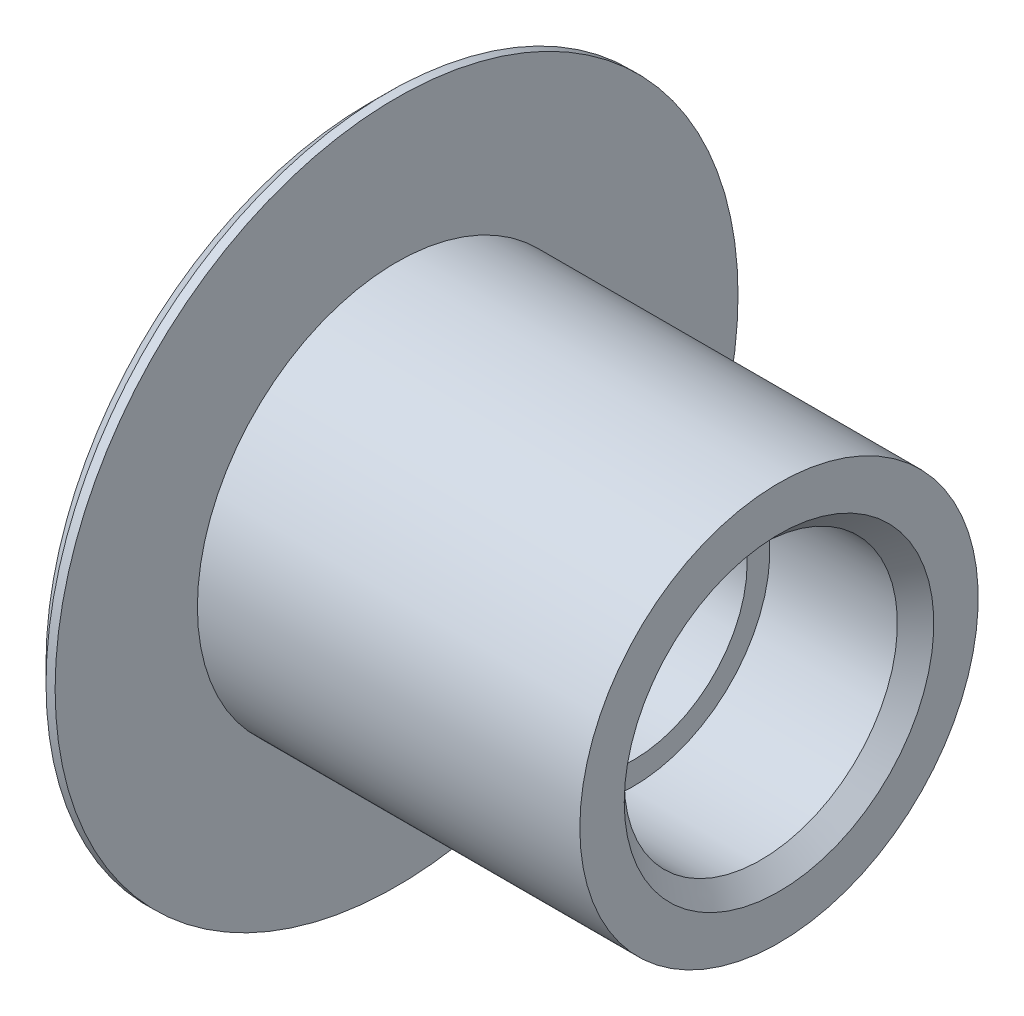
ISO-10303-21;
HEADER;
FILE_DESCRIPTION(('STEP AP214'),'2;1');
FILE_NAME('part.step','',(''),(''),'','','');
FILE_SCHEMA(('AUTOMOTIVE_DESIGN { 1 0 10303 214 1 1 1 1 }'));
ENDSEC;
DATA;
#1=APPLICATION_CONTEXT('core data for automotive mechanical design processes');
#2=APPLICATION_PROTOCOL_DEFINITION('international standard','automotive_design',2000,#1);
#3=PRODUCT_CONTEXT('',#1,'mechanical');
#4=PRODUCT('Part','Part','',(#3));
#5=PRODUCT_RELATED_PRODUCT_CATEGORY('part','',(#4));
#6=PRODUCT_DEFINITION_FORMATION('','',#4);
#7=PRODUCT_DEFINITION_CONTEXT('part definition',#1,'design');
#8=PRODUCT_DEFINITION('design','',#6,#7);
#9=PRODUCT_DEFINITION_SHAPE('','',#8);
#10=(LENGTH_UNIT() NAMED_UNIT(*) SI_UNIT(.MILLI.,.METRE.));
#11=(NAMED_UNIT(*) PLANE_ANGLE_UNIT() SI_UNIT($,.RADIAN.));
#12=(NAMED_UNIT(*) SI_UNIT($,.STERADIAN.) SOLID_ANGLE_UNIT());
#13=UNCERTAINTY_MEASURE_WITH_UNIT(LENGTH_MEASURE(1.E-05),#10,'distance_accuracy_value','');
#14=(GEOMETRIC_REPRESENTATION_CONTEXT(3) GLOBAL_UNCERTAINTY_ASSIGNED_CONTEXT((#13)) GLOBAL_UNIT_ASSIGNED_CONTEXT((#10,
#11,#12)) REPRESENTATION_CONTEXT('',''));
#15=CARTESIAN_POINT('',(0.,0.,0.));
#16=DIRECTION('',(0.,0.,1.));
#17=DIRECTION('',(1.,0.,0.));
#18=AXIS2_PLACEMENT_3D('',#15,#16,#17);
#19=CARTESIAN_POINT('',(-38.5103067368814,2.28177549359779,0.));
#20=DIRECTION('',(1.,0.,0.));
#21=DIRECTION('',(0.,0.,-1.));
#22=AXIS2_PLACEMENT_3D('',#19,#20,#21);
#23=PLANE('',#22);
#24=CARTESIAN_POINT('',(-38.5103067368814,-7.24322450640221,0.));
#25=DIRECTION('',(1.,0.,0.));
#26=DIRECTION('',(0.,0.,-1.));
#27=AXIS2_PLACEMENT_3D('',#24,#25,#26);
#28=CIRCLE('',#27,9.017);
#29=CARTESIAN_POINT('',(-38.5103067368814,-7.24322450640221,-9.017));
#30=VERTEX_POINT('',#29);
#31=EDGE_CURVE('E69',#30,#30,#28,.F.);
#32=ORIENTED_EDGE('',*,*,#31,.T.);
#33=EDGE_LOOP('',(#32));
#34=FACE_BOUND('',#33,.T.);
#35=CARTESIAN_POINT('',(-38.5103067368814,-7.24322450640221,0.));
#36=DIRECTION('',(1.,0.,0.));
#37=DIRECTION('',(0.,0.,-1.));
#38=AXIS2_PLACEMENT_3D('',#35,#36,#37);
#39=CIRCLE('',#38,3.683);
#40=CARTESIAN_POINT('',(-38.5103067368814,-7.24322450640221,-3.683));
#41=VERTEX_POINT('',#40);
#42=EDGE_CURVE('E74',#41,#41,#39,.T.);
#43=ORIENTED_EDGE('',*,*,#42,.T.);
#44=EDGE_LOOP('',(#43));
#45=FACE_BOUND('',#44,.T.);
#46=ADVANCED_FACE('F44',(#34,#45),#23,.F.);
#47=CARTESIAN_POINT('',(-27.5883067368814,-7.24322450640221,0.));
#48=DIRECTION('',(-1.,0.,0.));
#49=DIRECTION('',(0.,0.,1.));
#50=AXIS2_PLACEMENT_3D('',#47,#48,#49);
#51=CYLINDRICAL_SURFACE('',#50,3.175);
#52=CARTESIAN_POINT('',(-38.0023067368814,-7.24322450640221,0.));
#53=DIRECTION('',(1.,0.,0.));
#54=DIRECTION('',(0.,0.,-1.));
#55=AXIS2_PLACEMENT_3D('',#52,#53,#54);
#56=CIRCLE('',#55,3.175);
#57=CARTESIAN_POINT('',(-38.0023067368814,-7.24322450640221,-3.175));
#58=VERTEX_POINT('',#57);
#59=EDGE_CURVE('E56',#58,#58,#56,.F.);
#60=ORIENTED_EDGE('',*,*,#59,.T.);
#61=EDGE_LOOP('',(#60));
#62=FACE_BOUND('',#61,.T.);
#63=CARTESIAN_POINT('',(-31.1443067368814,-7.24322450640221,0.));
#64=DIRECTION('',(-1.,0.,0.));
#65=DIRECTION('',(0.,0.,1.));
#66=AXIS2_PLACEMENT_3D('',#63,#64,#65);
#67=CIRCLE('',#66,3.175);
#68=CARTESIAN_POINT('',(-31.1443067368814,-7.24322450640221,3.175));
#69=VERTEX_POINT('',#68);
#70=EDGE_CURVE('E77',#69,#69,#67,.T.);
#71=ORIENTED_EDGE('',*,*,#70,.F.);
#72=EDGE_LOOP('',(#71));
#73=FACE_BOUND('',#72,.T.);
#74=ADVANCED_FACE('F123',(#62,#73),#51,.F.);
#75=CARTESIAN_POINT('',(-31.1443067368814,-3.43322450640221,0.));
#76=DIRECTION('',(-1.,0.,0.));
#77=DIRECTION('',(0.,0.,1.));
#78=AXIS2_PLACEMENT_3D('',#75,#76,#77);
#79=PLANE('',#78);
#80=CARTESIAN_POINT('',(-31.1443067368814,-7.24322450640221,0.));
#81=DIRECTION('',(-1.,0.,0.));
#82=DIRECTION('',(0.,0.,1.));
#83=AXIS2_PLACEMENT_3D('',#80,#81,#82);
#84=CIRCLE('',#83,3.81);
#85=CARTESIAN_POINT('',(-31.1443067368814,-7.24322450640221,3.81));
#86=VERTEX_POINT('',#85);
#87=EDGE_CURVE('E85',#86,#86,#84,.T.);
#88=ORIENTED_EDGE('',*,*,#87,.F.);
#89=EDGE_LOOP('',(#88));
#90=FACE_BOUND('',#89,.T.);
#91=ORIENTED_EDGE('',*,*,#70,.T.);
#92=EDGE_LOOP('',(#91));
#93=FACE_BOUND('',#92,.T.);
#94=ADVANCED_FACE('F121',(#90,#93),#79,.F.);
#95=CARTESIAN_POINT('',(-27.5883067368814,-7.24322450640221,0.));
#96=DIRECTION('',(-1.,0.,0.));
#97=DIRECTION('',(0.,0.,1.));
#98=AXIS2_PLACEMENT_3D('',#95,#96,#97);
#99=CYLINDRICAL_SURFACE('',#98,3.81);
#100=CARTESIAN_POINT('',(-27.5883067368814,-7.24322450640221,0.));
#101=DIRECTION('',(-1.,0.,0.));
#102=DIRECTION('',(0.,0.,1.));
#103=AXIS2_PLACEMENT_3D('',#100,#101,#102);
#104=CIRCLE('',#103,3.81);
#105=CARTESIAN_POINT('',(-27.5883067368814,-7.24322450640221,3.81));
#106=VERTEX_POINT('',#105);
#107=EDGE_CURVE('E10',#106,#106,#104,.F.);
#108=ORIENTED_EDGE('',*,*,#107,.T.);
#109=EDGE_LOOP('',(#108));
#110=FACE_BOUND('',#109,.T.);
#111=ORIENTED_EDGE('',*,*,#87,.T.);
#112=EDGE_LOOP('',(#111));
#113=FACE_BOUND('',#112,.T.);
#114=ADVANCED_FACE('F113',(#110,#113),#99,.F.);
#115=CARTESIAN_POINT('',(-27.0803067368814,-1.68697450640221,0.));
#116=DIRECTION('',(-1.,0.,0.));
#117=DIRECTION('',(0.,0.,1.));
#118=AXIS2_PLACEMENT_3D('',#115,#116,#117);
#119=PLANE('',#118);
#120=CARTESIAN_POINT('',(-27.0803067368814,-7.24322450640221,0.));
#121=DIRECTION('',(-1.,0.,0.));
#122=DIRECTION('',(0.,0.,1.));
#123=AXIS2_PLACEMENT_3D('',#120,#121,#122);
#124=CIRCLE('',#123,4.318);
#125=CARTESIAN_POINT('',(-27.0803067368814,-7.24322450640221,4.318));
#126=VERTEX_POINT('',#125);
#127=EDGE_CURVE('E53',#126,#126,#124,.T.);
#128=ORIENTED_EDGE('',*,*,#127,.T.);
#129=EDGE_LOOP('',(#128));
#130=FACE_BOUND('',#129,.T.);
#131=CARTESIAN_POINT('',(-27.0803067368814,-7.24322450640221,0.));
#132=DIRECTION('',(-1.,0.,0.));
#133=DIRECTION('',(0.,0.,1.));
#134=AXIS2_PLACEMENT_3D('',#131,#132,#133);
#135=CIRCLE('',#134,5.55625);
#136=CARTESIAN_POINT('',(-27.0803067368814,-7.24322450640221,5.55625));
#137=VERTEX_POINT('',#136);
#138=EDGE_CURVE('E88',#137,#137,#135,.T.);
#139=ORIENTED_EDGE('',*,*,#138,.F.);
#140=EDGE_LOOP('',(#139));
#141=FACE_BOUND('',#140,.T.);
#142=ADVANCED_FACE('F109',(#130,#141),#119,.F.);
#143=CARTESIAN_POINT('',(-27.5883067368814,-7.24322450640221,0.));
#144=DIRECTION('',(-1.,0.,0.));
#145=DIRECTION('',(0.,0.,1.));
#146=AXIS2_PLACEMENT_3D('',#143,#144,#145);
#147=CYLINDRICAL_SURFACE('',#146,5.55625);
#148=CARTESIAN_POINT('',(-37.7483067368814,-7.24322450640221,0.));
#149=DIRECTION('',(-1.,0.,0.));
#150=DIRECTION('',(0.,0.,1.));
#151=AXIS2_PLACEMENT_3D('',#148,#149,#150);
#152=CIRCLE('',#151,5.55625);
#153=CARTESIAN_POINT('',(-37.7483067368814,-7.24322450640221,5.55625));
#154=VERTEX_POINT('',#153);
#155=EDGE_CURVE('E89',#154,#154,#152,.T.);
#156=ORIENTED_EDGE('',*,*,#155,.F.);
#157=EDGE_LOOP('',(#156));
#158=FACE_BOUND('',#157,.T.);
#159=ORIENTED_EDGE('',*,*,#138,.T.);
#160=EDGE_LOOP('',(#159));
#161=FACE_BOUND('',#160,.T.);
#162=ADVANCED_FACE('F102',(#158,#161),#147,.T.);
#163=CARTESIAN_POINT('',(-37.7483067368814,2.28177549359779,0.));
#164=DIRECTION('',(-1.,0.,0.));
#165=DIRECTION('',(0.,0.,1.));
#166=AXIS2_PLACEMENT_3D('',#163,#164,#165);
#167=PLANE('',#166);
#168=CARTESIAN_POINT('',(-37.7483067368814,-7.24322450640221,0.));
#169=DIRECTION('',(-1.,0.,0.));
#170=DIRECTION('',(0.,0.,1.));
#171=AXIS2_PLACEMENT_3D('',#168,#169,#170);
#172=CIRCLE('',#171,9.525);
#173=CARTESIAN_POINT('',(-37.7483067368814,-7.24322450640221,9.525));
#174=VERTEX_POINT('',#173);
#175=EDGE_CURVE('E94',#174,#174,#172,.T.);
#176=ORIENTED_EDGE('',*,*,#175,.F.);
#177=EDGE_LOOP('',(#176));
#178=FACE_BOUND('',#177,.T.);
#179=ORIENTED_EDGE('',*,*,#155,.T.);
#180=EDGE_LOOP('',(#179));
#181=FACE_BOUND('',#180,.T.);
#182=ADVANCED_FACE('F101',(#178,#181),#167,.F.);
#183=CARTESIAN_POINT('',(-27.5883067368814,-7.24322450640221,0.));
#184=DIRECTION('',(-1.,0.,0.));
#185=DIRECTION('',(0.,0.,1.));
#186=AXIS2_PLACEMENT_3D('',#183,#184,#185);
#187=CYLINDRICAL_SURFACE('',#186,9.525);
#188=CARTESIAN_POINT('',(-38.0023067368814,-7.24322450640221,0.));
#189=DIRECTION('',(1.,0.,0.));
#190=DIRECTION('',(0.,0.,-1.));
#191=AXIS2_PLACEMENT_3D('',#188,#189,#190);
#192=CIRCLE('',#191,9.525);
#193=CARTESIAN_POINT('',(-38.0023067368814,-7.24322450640221,-9.525));
#194=VERTEX_POINT('',#193);
#195=EDGE_CURVE('E65',#194,#194,#192,.T.);
#196=ORIENTED_EDGE('',*,*,#195,.T.);
#197=EDGE_LOOP('',(#196));
#198=FACE_BOUND('',#197,.T.);
#199=ORIENTED_EDGE('',*,*,#175,.T.);
#200=EDGE_LOOP('',(#199));
#201=FACE_BOUND('',#200,.T.);
#202=ADVANCED_FACE('F97',(#198,#201),#187,.T.);
#203=CARTESIAN_POINT('',(-38.5103067368814,-7.24322450640221,0.));
#204=DIRECTION('',(1.,0.,0.));
#205=DIRECTION('',(0.,0.,-1.));
#206=AXIS2_PLACEMENT_3D('',#203,#204,#205);
#207=CONICAL_SURFACE('',#206,9.017,0.785398163397443);
#208=ORIENTED_EDGE('',*,*,#195,.F.);
#209=EDGE_LOOP('',(#208));
#210=FACE_BOUND('',#209,.T.);
#211=ORIENTED_EDGE('',*,*,#31,.F.);
#212=EDGE_LOOP('',(#211));
#213=FACE_BOUND('',#212,.T.);
#214=ADVANCED_FACE('F136',(#210,#213),#207,.T.);
#215=CARTESIAN_POINT('',(-38.0023067368814,-7.24322450640221,0.));
#216=DIRECTION('',(-1.,0.,0.));
#217=DIRECTION('',(0.,0.,1.));
#218=AXIS2_PLACEMENT_3D('',#215,#216,#217);
#219=CONICAL_SURFACE('',#218,3.175,0.785398163397449);
#220=ORIENTED_EDGE('',*,*,#42,.F.);
#221=EDGE_LOOP('',(#220));
#222=FACE_BOUND('',#221,.T.);
#223=ORIENTED_EDGE('',*,*,#59,.F.);
#224=EDGE_LOOP('',(#223));
#225=FACE_BOUND('',#224,.T.);
#226=ADVANCED_FACE('F143',(#222,#225),#219,.F.);
#227=CARTESIAN_POINT('',(-27.0803067368814,-7.24322450640221,0.));
#228=DIRECTION('',(1.,0.,0.));
#229=DIRECTION('',(0.,0.,-1.));
#230=AXIS2_PLACEMENT_3D('',#227,#228,#229);
#231=CONICAL_SURFACE('',#230,4.318,0.78539816339745);
#232=ORIENTED_EDGE('',*,*,#107,.F.);
#233=EDGE_LOOP('',(#232));
#234=FACE_BOUND('',#233,.T.);
#235=ORIENTED_EDGE('',*,*,#127,.F.);
#236=EDGE_LOOP('',(#235));
#237=FACE_BOUND('',#236,.T.);
#238=ADVANCED_FACE('F48',(#234,#237),#231,.F.);
#239=CLOSED_SHELL('',(#46,#74,#94,#114,#142,#162,#182,#202,#214,#226,#238));
#240=MANIFOLD_SOLID_BREP('B2',#239);
#241=ADVANCED_BREP_SHAPE_REPRESENTATION('',(#18,#240),#14);
#242=SHAPE_DEFINITION_REPRESENTATION(#9,#241);
ENDSEC;
END-ISO-10303-21;
